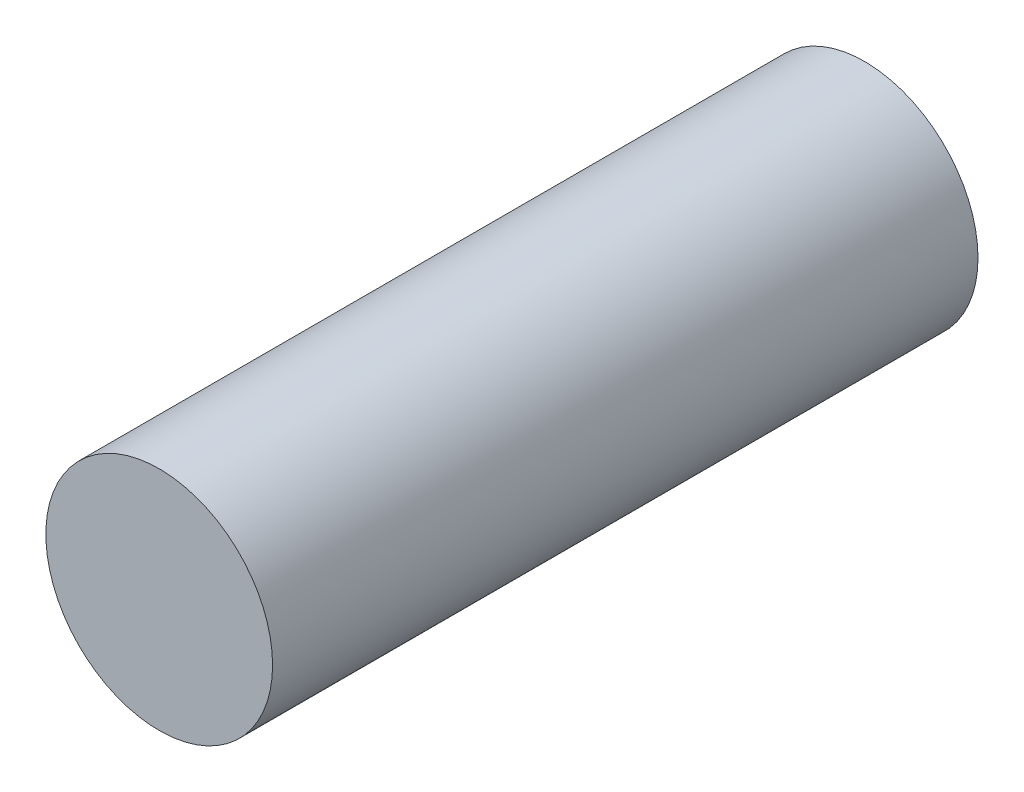
ISO-10303-21;
HEADER;
FILE_DESCRIPTION(('STEP AP214'),'2;1');
FILE_NAME('part.step','',(''),(''),'','','');
FILE_SCHEMA(('AUTOMOTIVE_DESIGN { 1 0 10303 214 1 1 1 1 }'));
ENDSEC;
DATA;
#1=APPLICATION_CONTEXT('core data for automotive mechanical design processes');
#2=APPLICATION_PROTOCOL_DEFINITION('international standard','automotive_design',2000,#1);
#3=PRODUCT_CONTEXT('',#1,'mechanical');
#4=PRODUCT('Part','Part','',(#3));
#5=PRODUCT_RELATED_PRODUCT_CATEGORY('part','',(#4));
#6=PRODUCT_DEFINITION_FORMATION('','',#4);
#7=PRODUCT_DEFINITION_CONTEXT('part definition',#1,'design');
#8=PRODUCT_DEFINITION('design','',#6,#7);
#9=PRODUCT_DEFINITION_SHAPE('','',#8);
#10=(LENGTH_UNIT() NAMED_UNIT(*) SI_UNIT(.MILLI.,.METRE.));
#11=(NAMED_UNIT(*) PLANE_ANGLE_UNIT() SI_UNIT($,.RADIAN.));
#12=(NAMED_UNIT(*) SI_UNIT($,.STERADIAN.) SOLID_ANGLE_UNIT());
#13=UNCERTAINTY_MEASURE_WITH_UNIT(LENGTH_MEASURE(1.E-05),#10,'distance_accuracy_value','');
#14=(GEOMETRIC_REPRESENTATION_CONTEXT(3) GLOBAL_UNCERTAINTY_ASSIGNED_CONTEXT((#13)) GLOBAL_UNIT_ASSIGNED_CONTEXT((#10,
#11,#12)) REPRESENTATION_CONTEXT('',''));
#15=CARTESIAN_POINT('',(0.,0.,0.));
#16=DIRECTION('',(0.,0.,1.));
#17=DIRECTION('',(1.,0.,0.));
#18=AXIS2_PLACEMENT_3D('',#15,#16,#17);
#19=CARTESIAN_POINT('',(0.,0.,56.));
#20=DIRECTION('',(0.,0.,-1.));
#21=DIRECTION('',(-1.,0.,0.));
#22=AXIS2_PLACEMENT_3D('',#19,#20,#21);
#23=CYLINDRICAL_SURFACE('',#22,9.);
#24=CARTESIAN_POINT('',(0.,0.,56.));
#25=DIRECTION('',(0.,0.,1.));
#26=DIRECTION('',(1.,0.,0.));
#27=AXIS2_PLACEMENT_3D('',#24,#25,#26);
#28=CIRCLE('',#27,9.);
#29=CARTESIAN_POINT('',(9.,0.,56.));
#30=VERTEX_POINT('',#29);
#31=EDGE_CURVE('E10',#30,#30,#28,.T.);
#32=ORIENTED_EDGE('',*,*,#31,.F.);
#33=EDGE_LOOP('',(#32));
#34=FACE_BOUND('',#33,.T.);
#35=CARTESIAN_POINT('',(0.,0.,0.));
#36=DIRECTION('',(0.,0.,1.));
#37=DIRECTION('',(1.,0.,0.));
#38=AXIS2_PLACEMENT_3D('',#35,#36,#37);
#39=CIRCLE('',#38,9.);
#40=CARTESIAN_POINT('',(9.,0.,0.));
#41=VERTEX_POINT('',#40);
#42=EDGE_CURVE('E40',#41,#41,#39,.T.);
#43=ORIENTED_EDGE('',*,*,#42,.T.);
#44=EDGE_LOOP('',(#43));
#45=FACE_BOUND('',#44,.T.);
#46=ADVANCED_FACE('F37',(#34,#45),#23,.T.);
#47=CARTESIAN_POINT('',(0.,0.,56.));
#48=DIRECTION('',(0.,0.,1.));
#49=DIRECTION('',(1.,0.,0.));
#50=AXIS2_PLACEMENT_3D('',#47,#48,#49);
#51=PLANE('',#50);
#52=ORIENTED_EDGE('',*,*,#31,.T.);
#53=EDGE_LOOP('',(#52));
#54=FACE_BOUND('',#53,.T.);
#55=ADVANCED_FACE('F54',(#54),#51,.T.);
#56=CARTESIAN_POINT('',(0.,0.,0.));
#57=DIRECTION('',(0.,0.,1.));
#58=DIRECTION('',(1.,0.,0.));
#59=AXIS2_PLACEMENT_3D('',#56,#57,#58);
#60=PLANE('',#59);
#61=ORIENTED_EDGE('',*,*,#42,.F.);
#62=EDGE_LOOP('',(#61));
#63=FACE_BOUND('',#62,.T.);
#64=ADVANCED_FACE('F52',(#63),#60,.F.);
#65=CLOSED_SHELL('',(#46,#55,#64));
#66=MANIFOLD_SOLID_BREP('B2',#65);
#67=ADVANCED_BREP_SHAPE_REPRESENTATION('',(#18,#66),#14);
#68=SHAPE_DEFINITION_REPRESENTATION(#9,#67);
ENDSEC;
END-ISO-10303-21;
